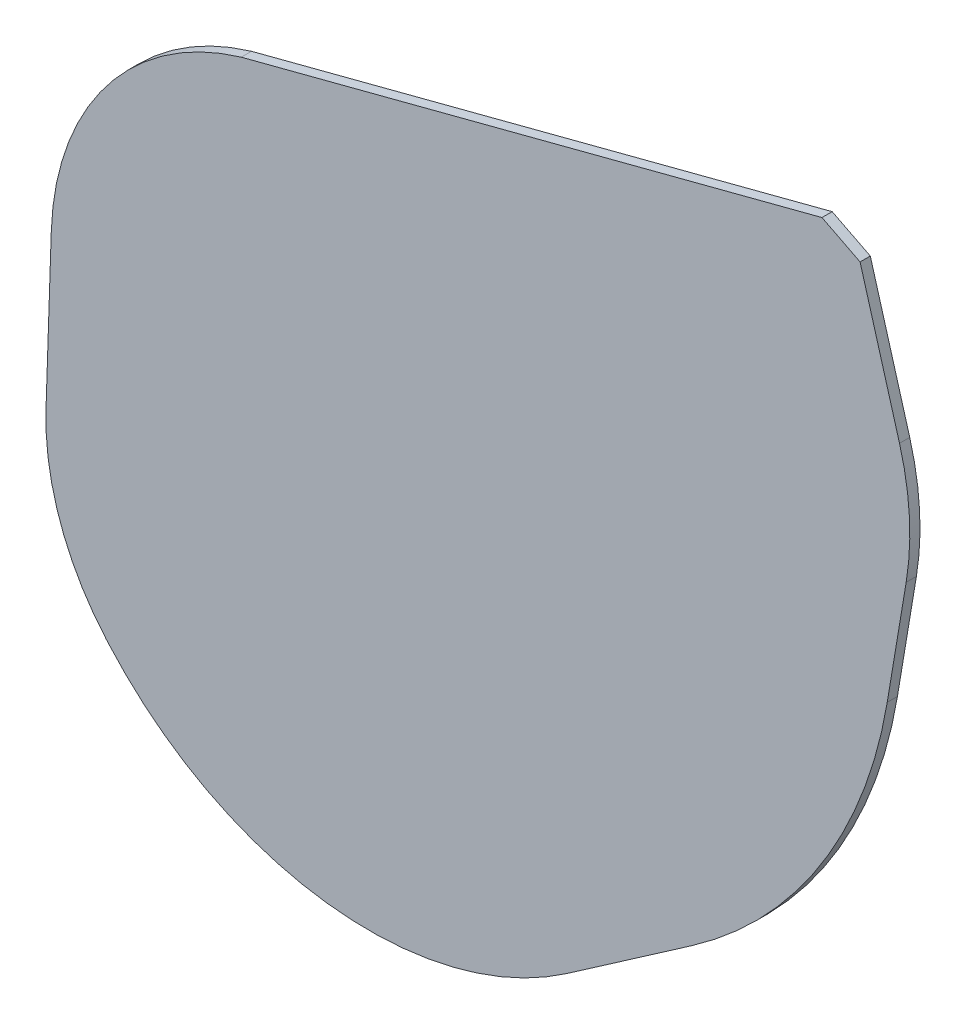
ISO-10303-21;
HEADER;
FILE_DESCRIPTION(('STEP AP214'),'2;1');
FILE_NAME('part.step','',(''),(''),'','','');
FILE_SCHEMA(('AUTOMOTIVE_DESIGN { 1 0 10303 214 1 1 1 1 }'));
ENDSEC;
DATA;
#1=APPLICATION_CONTEXT('core data for automotive mechanical design processes');
#2=APPLICATION_PROTOCOL_DEFINITION('international standard','automotive_design',2000,#1);
#3=PRODUCT_CONTEXT('',#1,'mechanical');
#4=PRODUCT('Part','Part','',(#3));
#5=PRODUCT_RELATED_PRODUCT_CATEGORY('part','',(#4));
#6=PRODUCT_DEFINITION_FORMATION('','',#4);
#7=PRODUCT_DEFINITION_CONTEXT('part definition',#1,'design');
#8=PRODUCT_DEFINITION('design','',#6,#7);
#9=PRODUCT_DEFINITION_SHAPE('','',#8);
#10=(LENGTH_UNIT() NAMED_UNIT(*) SI_UNIT(.MILLI.,.METRE.));
#11=(NAMED_UNIT(*) PLANE_ANGLE_UNIT() SI_UNIT($,.RADIAN.));
#12=(NAMED_UNIT(*) SI_UNIT($,.STERADIAN.) SOLID_ANGLE_UNIT());
#13=UNCERTAINTY_MEASURE_WITH_UNIT(LENGTH_MEASURE(1.E-05),#10,'distance_accuracy_value','');
#14=(GEOMETRIC_REPRESENTATION_CONTEXT(3) GLOBAL_UNCERTAINTY_ASSIGNED_CONTEXT((#13)) GLOBAL_UNIT_ASSIGNED_CONTEXT((#10,
#11,#12)) REPRESENTATION_CONTEXT('',''));
#15=CARTESIAN_POINT('',(0.,0.,0.));
#16=DIRECTION('',(0.,0.,1.));
#17=DIRECTION('',(1.,0.,0.));
#18=AXIS2_PLACEMENT_3D('',#15,#16,#17);
#19=CARTESIAN_POINT('',(196.894837030832,296.342844242729,2.54));
#20=DIRECTION('',(-0.453205106508998,-0.891406266207596,0.));
#21=DIRECTION('',(0.891406266207597,-0.453205106508998,0.));
#22=AXIS2_PLACEMENT_3D('',#19,#20,#21);
#23=PLANE('',#22);
#24=DIRECTION('',(-0.891406266207596,0.453205106508998,0.));
#25=VECTOR('',#24,1.);
#26=CARTESIAN_POINT('',(196.894837030832,296.342844242729,0.));
#27=LINE('',#26,#25);
#28=CARTESIAN_POINT('',(206.373128661955,291.523930206505,0.));
#29=VERTEX_POINT('',#28);
#30=CARTESIAN_POINT('',(196.894837030832,296.342844242729,0.));
#31=VERTEX_POINT('',#30);
#32=EDGE_CURVE('E159',#29,#31,#27,.T.);
#33=ORIENTED_EDGE('',*,*,#32,.T.);
#34=DIRECTION('',(0.,0.,-1.));
#35=VECTOR('',#34,1.);
#36=CARTESIAN_POINT('',(196.894837030832,296.342844242729,2.54));
#37=LINE('',#36,#35);
#38=CARTESIAN_POINT('',(196.894837030832,296.342844242729,2.54));
#39=VERTEX_POINT('',#38);
#40=EDGE_CURVE('E11',#39,#31,#37,.T.);
#41=ORIENTED_EDGE('',*,*,#40,.F.);
#42=DIRECTION('',(-0.891406266207596,0.453205106508998,0.));
#43=VECTOR('',#42,1.);
#44=CARTESIAN_POINT('',(196.894837030832,296.342844242729,2.54));
#45=LINE('',#44,#43);
#46=CARTESIAN_POINT('',(206.373128661955,291.523930206505,2.54));
#47=VERTEX_POINT('',#46);
#48=EDGE_CURVE('E181',#47,#39,#45,.T.);
#49=ORIENTED_EDGE('',*,*,#48,.F.);
#50=DIRECTION('',(0.,0.,-1.));
#51=VECTOR('',#50,1.);
#52=CARTESIAN_POINT('',(206.373128661955,291.523930206505,2.54));
#53=LINE('',#52,#51);
#54=EDGE_CURVE('E155',#47,#29,#53,.T.);
#55=ORIENTED_EDGE('',*,*,#54,.T.);
#56=EDGE_LOOP('',(#33,#41,#49,#55));
#57=FACE_BOUND('',#56,.T.);
#58=ADVANCED_FACE('F39',(#57),#23,.F.);
#59=CARTESIAN_POINT('',(52.4805441545708,258.674987582046,2.54));
#60=DIRECTION('',(0.2523877875479,-0.967626169911023,0.));
#61=DIRECTION('',(0.967626169911023,0.2523877875479,0.));
#62=AXIS2_PLACEMENT_3D('',#59,#60,#61);
#63=PLANE('',#62);
#64=DIRECTION('',(-0.967626169911023,-0.2523877875479,0.));
#65=VECTOR('',#64,1.);
#66=CARTESIAN_POINT('',(52.4805441545708,258.674987582046,0.));
#67=LINE('',#66,#65);
#68=CARTESIAN_POINT('',(52.4805441545708,258.674987582046,0.));
#69=VERTEX_POINT('',#68);
#70=EDGE_CURVE('E162',#31,#69,#67,.T.);
#71=ORIENTED_EDGE('',*,*,#70,.T.);
#72=DIRECTION('',(0.,0.,-1.));
#73=VECTOR('',#72,1.);
#74=CARTESIAN_POINT('',(52.4805441545708,258.674987582046,2.54));
#75=LINE('',#74,#73);
#76=CARTESIAN_POINT('',(52.4805441545708,258.674987582046,2.54));
#77=VERTEX_POINT('',#76);
#78=EDGE_CURVE('E47',#77,#69,#75,.T.);
#79=ORIENTED_EDGE('',*,*,#78,.F.);
#80=DIRECTION('',(-0.967626169911023,-0.2523877875479,0.));
#81=VECTOR('',#80,1.);
#82=CARTESIAN_POINT('',(52.4805441545708,258.674987582046,2.54));
#83=LINE('',#82,#81);
#84=EDGE_CURVE('E110',#39,#77,#83,.T.);
#85=ORIENTED_EDGE('',*,*,#84,.F.);
#86=ORIENTED_EDGE('',*,*,#40,.T.);
#87=EDGE_LOOP('',(#71,#79,#85,#86));
#88=FACE_BOUND('',#87,.T.);
#89=ADVANCED_FACE('F259',(#88),#63,.F.);
#90=CARTESIAN_POINT('',(71.229054664981,195.352203738938,2.54));
#91=DIRECTION('',(0.,0.,-1.));
#92=DIRECTION('',(-1.,0.,0.));
#93=AXIS2_PLACEMENT_3D('',#90,#91,#92);
#94=CYLINDRICAL_SURFACE('',#93,66.04);
#95=CARTESIAN_POINT('',(71.229054664981,195.352203738938,0.));
#96=DIRECTION('',(0.,0.,1.));
#97=DIRECTION('',(1.,0.,0.));
#98=AXIS2_PLACEMENT_3D('',#95,#96,#97);
#99=CIRCLE('',#98,66.04);
#100=CARTESIAN_POINT('',(5.22643110361282,197.573753426955,0.));
#101=VERTEX_POINT('',#100);
#102=EDGE_CURVE('E164',#69,#101,#99,.T.);
#103=ORIENTED_EDGE('',*,*,#102,.T.);
#104=DIRECTION('',(0.,0.,-1.));
#105=VECTOR('',#104,1.);
#106=CARTESIAN_POINT('',(5.22643110361282,197.573753426955,2.54));
#107=LINE('',#106,#105);
#108=CARTESIAN_POINT('',(5.22643110361282,197.573753426955,2.54));
#109=VERTEX_POINT('',#108);
#110=EDGE_CURVE('E200',#109,#101,#107,.T.);
#111=ORIENTED_EDGE('',*,*,#110,.F.);
#112=CARTESIAN_POINT('',(71.229054664981,195.352203738938,2.54));
#113=DIRECTION('',(0.,0.,1.));
#114=DIRECTION('',(1.,0.,0.));
#115=AXIS2_PLACEMENT_3D('',#112,#113,#114);
#116=CIRCLE('',#115,66.04);
#117=EDGE_CURVE('E208',#77,#109,#116,.T.);
#118=ORIENTED_EDGE('',*,*,#117,.F.);
#119=ORIENTED_EDGE('',*,*,#78,.T.);
#120=EDGE_LOOP('',(#103,#111,#118,#119));
#121=FACE_BOUND('',#120,.T.);
#122=ADVANCED_FACE('F206',(#121),#94,.T.);
#123=CARTESIAN_POINT('',(3.91533798999884,158.62095138136,2.54));
#124=DIRECTION('',(0.999434033333861,-0.0336394562086107,0.));
#125=DIRECTION('',(0.0336394562086107,0.999434033333861,0.));
#126=AXIS2_PLACEMENT_3D('',#123,#124,#125);
#127=PLANE('',#126);
#128=DIRECTION('',(-0.0336394562086107,-0.999434033333861,0.));
#129=VECTOR('',#128,1.);
#130=CARTESIAN_POINT('',(3.91533798999884,158.62095138136,0.));
#131=LINE('',#130,#129);
#132=CARTESIAN_POINT('',(3.91533798999884,158.62095138136,0.));
#133=VERTEX_POINT('',#132);
#134=EDGE_CURVE('E166',#101,#133,#131,.T.);
#135=ORIENTED_EDGE('',*,*,#134,.T.);
#136=DIRECTION('',(0.,0.,-1.));
#137=VECTOR('',#136,1.);
#138=CARTESIAN_POINT('',(3.91533798999884,158.62095138136,2.54));
#139=LINE('',#138,#137);
#140=CARTESIAN_POINT('',(3.91533798999884,158.62095138136,2.54));
#141=VERTEX_POINT('',#140);
#142=EDGE_CURVE('E197',#141,#133,#139,.T.);
#143=ORIENTED_EDGE('',*,*,#142,.F.);
#144=DIRECTION('',(-0.0336394562086107,-0.999434033333861,0.));
#145=VECTOR('',#144,1.);
#146=CARTESIAN_POINT('',(3.91533798999884,158.62095138136,2.54));
#147=LINE('',#146,#145);
#148=EDGE_CURVE('E226',#109,#141,#147,.T.);
#149=ORIENTED_EDGE('',*,*,#148,.F.);
#150=ORIENTED_EDGE('',*,*,#110,.T.);
#151=EDGE_LOOP('',(#135,#143,#149,#150));
#152=FACE_BOUND('',#151,.T.);
#153=ADVANCED_FACE('F217',(#152),#127,.F.);
#154=CARTESIAN_POINT('',(64.840836662031,156.570290130882,2.54));
#155=DIRECTION('',(0.,0.,-1.));
#156=DIRECTION('',(-1.,0.,0.));
#157=AXIS2_PLACEMENT_3D('',#154,#155,#156);
#158=CYLINDRICAL_SURFACE('',#157,60.96);
#159=CARTESIAN_POINT('',(64.840836662031,156.570290130882,0.));
#160=DIRECTION('',(0.,0.,1.));
#161=DIRECTION('',(-1.,0.,0.));
#162=AXIS2_PLACEMENT_3D('',#159,#160,#161);
#163=CIRCLE('',#162,60.96);
#164=CARTESIAN_POINT('',(18.9488222886056,116.444928864604,0.));
#165=VERTEX_POINT('',#164);
#166=EDGE_CURVE('E168',#133,#165,#163,.T.);
#167=ORIENTED_EDGE('',*,*,#166,.T.);
#168=DIRECTION('',(0.,0.,-1.));
#169=VECTOR('',#168,1.);
#170=CARTESIAN_POINT('',(18.9488222886056,116.444928864604,2.54));
#171=LINE('',#170,#169);
#172=CARTESIAN_POINT('',(18.9488222886056,116.444928864604,2.54));
#173=VERTEX_POINT('',#172);
#174=EDGE_CURVE('E194',#173,#165,#171,.T.);
#175=ORIENTED_EDGE('',*,*,#174,.F.);
#176=CARTESIAN_POINT('',(64.840836662031,156.570290130882,2.54));
#177=DIRECTION('',(0.,0.,1.));
#178=DIRECTION('',(-1.,0.,0.));
#179=AXIS2_PLACEMENT_3D('',#176,#177,#178);
#180=CIRCLE('',#179,60.96);
#181=EDGE_CURVE('E223',#141,#173,#180,.T.);
#182=ORIENTED_EDGE('',*,*,#181,.F.);
#183=ORIENTED_EDGE('',*,*,#142,.T.);
#184=EDGE_LOOP('',(#167,#175,#182,#183));
#185=FACE_BOUND('',#184,.T.);
#186=ADVANCED_FACE('F221',(#185),#158,.T.);
#187=CARTESIAN_POINT('',(19.3435879886939,115.993429049753,2.54));
#188=DIRECTION('',(0.752821758094255,0.658224430221087,0.));
#189=DIRECTION('',(-0.658224430221087,0.752821758094255,0.));
#190=AXIS2_PLACEMENT_3D('',#187,#188,#189);
#191=PLANE('',#190);
#192=DIRECTION('',(0.658224430221087,-0.752821758094255,0.));
#193=VECTOR('',#192,1.);
#194=CARTESIAN_POINT('',(19.3435879886939,115.993429049753,0.));
#195=LINE('',#194,#193);
#196=CARTESIAN_POINT('',(19.3435879886939,115.993429049753,0.));
#197=VERTEX_POINT('',#196);
#198=EDGE_CURVE('E170',#165,#197,#195,.T.);
#199=ORIENTED_EDGE('',*,*,#198,.T.);
#200=DIRECTION('',(0.,0.,-1.));
#201=VECTOR('',#200,1.);
#202=CARTESIAN_POINT('',(19.3435879886939,115.993429049753,2.54));
#203=LINE('',#202,#201);
#204=CARTESIAN_POINT('',(19.3435879886939,115.993429049753,2.54));
#205=VERTEX_POINT('',#204);
#206=EDGE_CURVE('E191',#205,#197,#203,.T.);
#207=ORIENTED_EDGE('',*,*,#206,.F.);
#208=DIRECTION('',(0.658224430221087,-0.752821758094255,0.));
#209=VECTOR('',#208,1.);
#210=CARTESIAN_POINT('',(19.3435879886939,115.993429049753,2.54));
#211=LINE('',#210,#209);
#212=EDGE_CURVE('E225',#173,#205,#211,.T.);
#213=ORIENTED_EDGE('',*,*,#212,.F.);
#214=ORIENTED_EDGE('',*,*,#174,.T.);
#215=EDGE_LOOP('',(#199,#207,#213,#214));
#216=FACE_BOUND('',#215,.T.);
#217=ADVANCED_FACE('F272',(#216),#191,.F.);
#218=CARTESIAN_POINT('',(84.3572750177134,172.837690843646,2.54));
#219=DIRECTION('',(0.,0.,-1.));
#220=DIRECTION('',(-1.,0.,0.));
#221=AXIS2_PLACEMENT_3D('',#218,#219,#220);
#222=CYLINDRICAL_SURFACE('',#221,86.36);
#223=CARTESIAN_POINT('',(84.3572750177134,172.837690843646,0.));
#224=DIRECTION('',(0.,0.,1.));
#225=DIRECTION('',(-1.,0.,0.));
#226=AXIS2_PLACEMENT_3D('',#223,#224,#225);
#227=CIRCLE('',#226,86.36);
#228=CARTESIAN_POINT('',(133.56053826902,101.865242066514,0.));
#229=VERTEX_POINT('',#228);
#230=EDGE_CURVE('E172',#197,#229,#227,.T.);
#231=ORIENTED_EDGE('',*,*,#230,.T.);
#232=DIRECTION('',(0.,0.,-1.));
#233=VECTOR('',#232,1.);
#234=CARTESIAN_POINT('',(133.56053826902,101.865242066514,2.54));
#235=LINE('',#234,#233);
#236=CARTESIAN_POINT('',(133.56053826902,101.865242066514,2.54));
#237=VERTEX_POINT('',#236);
#238=EDGE_CURVE('E188',#237,#229,#235,.T.);
#239=ORIENTED_EDGE('',*,*,#238,.F.);
#240=CARTESIAN_POINT('',(84.3572750177134,172.837690843646,2.54));
#241=DIRECTION('',(0.,0.,1.));
#242=DIRECTION('',(-1.,0.,0.));
#243=AXIS2_PLACEMENT_3D('',#240,#241,#242);
#244=CIRCLE('',#243,86.36);
#245=EDGE_CURVE('E228',#205,#237,#244,.T.);
#246=ORIENTED_EDGE('',*,*,#245,.F.);
#247=ORIENTED_EDGE('',*,*,#206,.T.);
#248=EDGE_LOOP('',(#231,#239,#246,#247));
#249=FACE_BOUND('',#248,.T.);
#250=ADVANCED_FACE('F275',(#249),#222,.T.);
#251=CARTESIAN_POINT('',(164.448728673206,123.279182123537,2.54));
#252=DIRECTION('',(-0.569745984846071,0.821820851981611,0.));
#253=DIRECTION('',(-0.821820851981611,-0.569745984846071,0.));
#254=AXIS2_PLACEMENT_3D('',#251,#252,#253);
#255=PLANE('',#254);
#256=DIRECTION('',(0.821820851981611,0.569745984846071,0.));
#257=VECTOR('',#256,1.);
#258=CARTESIAN_POINT('',(164.448728673206,123.279182123537,0.));
#259=LINE('',#258,#257);
#260=CARTESIAN_POINT('',(164.448728673206,123.279182123537,0.));
#261=VERTEX_POINT('',#260);
#262=EDGE_CURVE('E174',#229,#261,#259,.T.);
#263=ORIENTED_EDGE('',*,*,#262,.T.);
#264=DIRECTION('',(0.,0.,-1.));
#265=VECTOR('',#264,1.);
#266=CARTESIAN_POINT('',(164.448728673206,123.279182123537,2.54));
#267=LINE('',#266,#265);
#268=CARTESIAN_POINT('',(164.448728673206,123.279182123537,2.54));
#269=VERTEX_POINT('',#268);
#270=EDGE_CURVE('E185',#269,#261,#267,.T.);
#271=ORIENTED_EDGE('',*,*,#270,.F.);
#272=DIRECTION('',(0.821820851981611,0.569745984846071,0.));
#273=VECTOR('',#272,1.);
#274=CARTESIAN_POINT('',(164.448728673206,123.279182123537,2.54));
#275=LINE('',#274,#273);
#276=EDGE_CURVE('E234',#237,#269,#275,.T.);
#277=ORIENTED_EDGE('',*,*,#276,.F.);
#278=ORIENTED_EDGE('',*,*,#238,.T.);
#279=EDGE_LOOP('',(#263,#271,#277,#278));
#280=FACE_BOUND('',#279,.T.);
#281=ADVANCED_FACE('F240',(#280),#255,.F.);
#282=CARTESIAN_POINT('',(97.8796078037908,219.300730469069,2.54));
#283=DIRECTION('',(0.,0.,-1.));
#284=DIRECTION('',(-1.,0.,0.));
#285=AXIS2_PLACEMENT_3D('',#282,#283,#284);
#286=CYLINDRICAL_SURFACE('',#285,116.84);
#287=CARTESIAN_POINT('',(97.8796078037908,219.300730469069,0.));
#288=DIRECTION('',(0.,0.,1.));
#289=DIRECTION('',(-1.,0.,0.));
#290=AXIS2_PLACEMENT_3D('',#287,#288,#289);
#291=CIRCLE('',#290,116.84);
#292=CARTESIAN_POINT('',(213.120538574569,200.036424743591,0.));
#293=VERTEX_POINT('',#292);
#294=EDGE_CURVE('E176',#261,#293,#291,.T.);
#295=ORIENTED_EDGE('',*,*,#294,.T.);
#296=DIRECTION('',(0.,0.,-1.));
#297=VECTOR('',#296,1.);
#298=CARTESIAN_POINT('',(213.120538574569,200.036424743591,2.54));
#299=LINE('',#298,#297);
#300=CARTESIAN_POINT('',(213.120538574569,200.036424743591,2.54));
#301=VERTEX_POINT('',#300);
#302=EDGE_CURVE('E150',#301,#293,#299,.T.);
#303=ORIENTED_EDGE('',*,*,#302,.F.);
#304=CARTESIAN_POINT('',(97.8796078037908,219.300730469069,2.54));
#305=DIRECTION('',(0.,0.,1.));
#306=DIRECTION('',(-1.,0.,0.));
#307=AXIS2_PLACEMENT_3D('',#304,#305,#306);
#308=CIRCLE('',#307,116.84);
#309=EDGE_CURVE('E141',#269,#301,#308,.T.);
#310=ORIENTED_EDGE('',*,*,#309,.F.);
#311=ORIENTED_EDGE('',*,*,#270,.T.);
#312=EDGE_LOOP('',(#295,#303,#310,#311));
#313=FACE_BOUND('',#312,.T.);
#314=ADVANCED_FACE('F244',(#313),#286,.T.);
#315=CARTESIAN_POINT('',(217.836941691047,228.250402074435,2.54));
#316=DIRECTION('',(-0.986314025768386,0.164877659410121,0.));
#317=DIRECTION('',(-0.164877659410121,-0.986314025768386,0.));
#318=AXIS2_PLACEMENT_3D('',#315,#316,#317);
#319=PLANE('',#318);
#320=DIRECTION('',(0.164877659410121,0.986314025768386,0.));
#321=VECTOR('',#320,1.);
#322=CARTESIAN_POINT('',(217.836941691047,228.250402074435,0.));
#323=LINE('',#322,#321);
#324=CARTESIAN_POINT('',(217.836941691047,228.250402074435,0.));
#325=VERTEX_POINT('',#324);
#326=EDGE_CURVE('E149',#293,#325,#323,.T.);
#327=ORIENTED_EDGE('',*,*,#326,.T.);
#328=DIRECTION('',(0.,0.,-1.));
#329=VECTOR('',#328,1.);
#330=CARTESIAN_POINT('',(217.836941691047,228.250402074435,2.54));
#331=LINE('',#330,#329);
#332=CARTESIAN_POINT('',(217.836941691047,228.250402074435,2.54));
#333=VERTEX_POINT('',#332);
#334=EDGE_CURVE('E146',#333,#325,#331,.T.);
#335=ORIENTED_EDGE('',*,*,#334,.F.);
#336=DIRECTION('',(0.164877659410121,0.986314025768386,0.));
#337=VECTOR('',#336,1.);
#338=CARTESIAN_POINT('',(217.836941691047,228.250402074435,2.54));
#339=LINE('',#338,#337);
#340=EDGE_CURVE('E135',#301,#333,#339,.T.);
#341=ORIENTED_EDGE('',*,*,#340,.F.);
#342=ORIENTED_EDGE('',*,*,#302,.T.);
#343=EDGE_LOOP('',(#327,#335,#341,#342));
#344=FACE_BOUND('',#343,.T.);
#345=ADVANCED_FACE('F147',(#344),#319,.F.);
#346=CARTESIAN_POINT('',(152.700763429303,239.138922701879,2.54));
#347=DIRECTION('',(0.,0.,-1.));
#348=DIRECTION('',(-1.,0.,0.));
#349=AXIS2_PLACEMENT_3D('',#346,#347,#348);
#350=CYLINDRICAL_SURFACE('',#349,66.04);
#351=CARTESIAN_POINT('',(152.700763429303,239.138922701879,0.));
#352=DIRECTION('',(0.,0.,1.));
#353=DIRECTION('',(-1.,0.,0.));
#354=AXIS2_PLACEMENT_3D('',#351,#352,#353);
#355=CIRCLE('',#354,66.04);
#356=CARTESIAN_POINT('',(216.178620917186,257.355486833131,0.));
#357=VERTEX_POINT('',#356);
#358=EDGE_CURVE('E96',#325,#357,#355,.T.);
#359=ORIENTED_EDGE('',*,*,#358,.T.);
#360=DIRECTION('',(0.,0.,-1.));
#361=VECTOR('',#360,1.);
#362=CARTESIAN_POINT('',(216.178620917186,257.355486833131,2.54));
#363=LINE('',#362,#361);
#364=CARTESIAN_POINT('',(216.178620917186,257.355486833131,2.54));
#365=VERTEX_POINT('',#364);
#366=EDGE_CURVE('E151',#365,#357,#363,.T.);
#367=ORIENTED_EDGE('',*,*,#366,.F.);
#368=CARTESIAN_POINT('',(152.700763429303,239.138922701879,2.54));
#369=DIRECTION('',(0.,0.,1.));
#370=DIRECTION('',(-1.,0.,0.));
#371=AXIS2_PLACEMENT_3D('',#368,#369,#370);
#372=CIRCLE('',#371,66.04);
#373=EDGE_CURVE('E139',#333,#365,#372,.T.);
#374=ORIENTED_EDGE('',*,*,#373,.F.);
#375=ORIENTED_EDGE('',*,*,#334,.T.);
#376=EDGE_LOOP('',(#359,#367,#374,#375));
#377=FACE_BOUND('',#376,.T.);
#378=ADVANCED_FACE('F153',(#377),#350,.T.);
#379=CARTESIAN_POINT('',(206.373128661955,291.523930206505,2.54));
#380=DIRECTION('',(-0.96120317213633,-0.275841370854804,0.));
#381=DIRECTION('',(0.275841370854804,-0.96120317213633,0.));
#382=AXIS2_PLACEMENT_3D('',#379,#380,#381);
#383=PLANE('',#382);
#384=DIRECTION('',(-0.275841370854804,0.961203172136329,0.));
#385=VECTOR('',#384,1.);
#386=CARTESIAN_POINT('',(206.373128661955,291.523930206505,0.));
#387=LINE('',#386,#385);
#388=EDGE_CURVE('E102',#357,#29,#387,.T.);
#389=ORIENTED_EDGE('',*,*,#388,.T.);
#390=ORIENTED_EDGE('',*,*,#54,.F.);
#391=DIRECTION('',(-0.275841370854804,0.961203172136329,0.));
#392=VECTOR('',#391,1.);
#393=CARTESIAN_POINT('',(206.373128661955,291.523930206505,2.54));
#394=LINE('',#393,#392);
#395=EDGE_CURVE('E55',#365,#47,#394,.T.);
#396=ORIENTED_EDGE('',*,*,#395,.F.);
#397=ORIENTED_EDGE('',*,*,#366,.T.);
#398=EDGE_LOOP('',(#389,#390,#396,#397));
#399=FACE_BOUND('',#398,.T.);
#400=ADVANCED_FACE('F248',(#399),#383,.F.);
#401=CARTESIAN_POINT('',(152.700763429303,239.138922701879,2.54));
#402=DIRECTION('',(0.,0.,-1.));
#403=DIRECTION('',(-1.,0.,0.));
#404=AXIS2_PLACEMENT_3D('',#401,#402,#403);
#405=PLANE('',#404);
#406=ORIENTED_EDGE('',*,*,#48,.T.);
#407=ORIENTED_EDGE('',*,*,#84,.T.);
#408=ORIENTED_EDGE('',*,*,#117,.T.);
#409=ORIENTED_EDGE('',*,*,#148,.T.);
#410=ORIENTED_EDGE('',*,*,#181,.T.);
#411=ORIENTED_EDGE('',*,*,#212,.T.);
#412=ORIENTED_EDGE('',*,*,#245,.T.);
#413=ORIENTED_EDGE('',*,*,#276,.T.);
#414=ORIENTED_EDGE('',*,*,#309,.T.);
#415=ORIENTED_EDGE('',*,*,#340,.T.);
#416=ORIENTED_EDGE('',*,*,#373,.T.);
#417=ORIENTED_EDGE('',*,*,#395,.T.);
#418=EDGE_LOOP('',(#406,#407,#408,#409,#410,#411,#412,#413,#414,#415,#416,#417));
#419=FACE_BOUND('',#418,.T.);
#420=ADVANCED_FACE('F137',(#419),#405,.F.);
#421=CARTESIAN_POINT('',(152.700763429303,239.138922701879,0.));
#422=DIRECTION('',(0.,0.,-1.));
#423=DIRECTION('',(-1.,0.,0.));
#424=AXIS2_PLACEMENT_3D('',#421,#422,#423);
#425=PLANE('',#424);
#426=ORIENTED_EDGE('',*,*,#32,.F.);
#427=ORIENTED_EDGE('',*,*,#388,.F.);
#428=ORIENTED_EDGE('',*,*,#358,.F.);
#429=ORIENTED_EDGE('',*,*,#326,.F.);
#430=ORIENTED_EDGE('',*,*,#294,.F.);
#431=ORIENTED_EDGE('',*,*,#262,.F.);
#432=ORIENTED_EDGE('',*,*,#230,.F.);
#433=ORIENTED_EDGE('',*,*,#198,.F.);
#434=ORIENTED_EDGE('',*,*,#166,.F.);
#435=ORIENTED_EDGE('',*,*,#134,.F.);
#436=ORIENTED_EDGE('',*,*,#102,.F.);
#437=ORIENTED_EDGE('',*,*,#70,.F.);
#438=EDGE_LOOP('',(#426,#427,#428,#429,#430,#431,#432,#433,#434,#435,#436,#437));
#439=FACE_BOUND('',#438,.T.);
#440=ADVANCED_FACE('F212',(#439),#425,.T.);
#441=CLOSED_SHELL('',(#58,#89,#122,#153,#186,#217,#250,#281,#314,#345,#378,#400,#420,#440));
#442=MANIFOLD_SOLID_BREP('B2',#441);
#443=ADVANCED_BREP_SHAPE_REPRESENTATION('',(#18,#442),#14);
#444=SHAPE_DEFINITION_REPRESENTATION(#9,#443);
ENDSEC;
END-ISO-10303-21;
